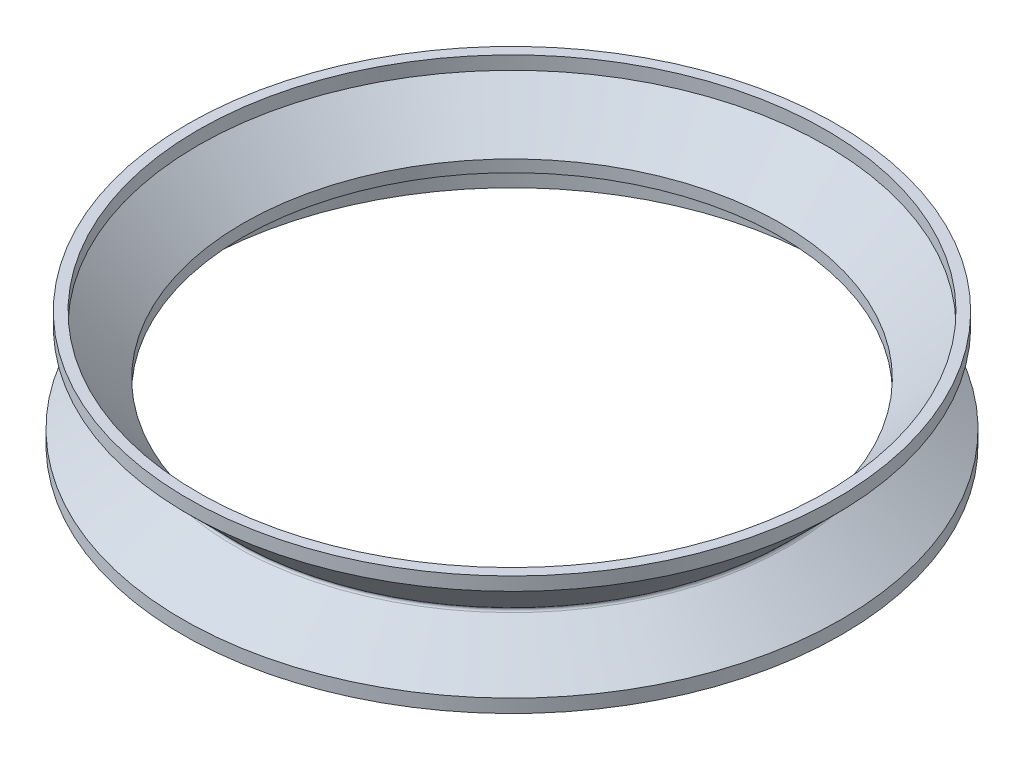
ISO-10303-21;
HEADER;
FILE_DESCRIPTION(('STEP AP214'),'2;1');
FILE_NAME('part.step','',(''),(''),'','','');
FILE_SCHEMA(('AUTOMOTIVE_DESIGN { 1 0 10303 214 1 1 1 1 }'));
ENDSEC;
DATA;
#1=APPLICATION_CONTEXT('core data for automotive mechanical design processes');
#2=APPLICATION_PROTOCOL_DEFINITION('international standard','automotive_design',2000,#1);
#3=PRODUCT_CONTEXT('',#1,'mechanical');
#4=PRODUCT('Part','Part','',(#3));
#5=PRODUCT_RELATED_PRODUCT_CATEGORY('part','',(#4));
#6=PRODUCT_DEFINITION_FORMATION('','',#4);
#7=PRODUCT_DEFINITION_CONTEXT('part definition',#1,'design');
#8=PRODUCT_DEFINITION('design','',#6,#7);
#9=PRODUCT_DEFINITION_SHAPE('','',#8);
#10=(LENGTH_UNIT() NAMED_UNIT(*) SI_UNIT(.MILLI.,.METRE.));
#11=(NAMED_UNIT(*) PLANE_ANGLE_UNIT() SI_UNIT($,.RADIAN.));
#12=(NAMED_UNIT(*) SI_UNIT($,.STERADIAN.) SOLID_ANGLE_UNIT());
#13=UNCERTAINTY_MEASURE_WITH_UNIT(LENGTH_MEASURE(1.E-05),#10,'distance_accuracy_value','');
#14=(GEOMETRIC_REPRESENTATION_CONTEXT(3) GLOBAL_UNCERTAINTY_ASSIGNED_CONTEXT((#13)) GLOBAL_UNIT_ASSIGNED_CONTEXT((#10,
#11,#12)) REPRESENTATION_CONTEXT('',''));
#15=CARTESIAN_POINT('',(0.,0.,0.));
#16=DIRECTION('',(0.,0.,1.));
#17=DIRECTION('',(1.,0.,0.));
#18=AXIS2_PLACEMENT_3D('',#15,#16,#17);
#19=CARTESIAN_POINT('',(41.7784168712443,0.,0.));
#20=DIRECTION('',(0.,-1.,0.));
#21=DIRECTION('',(1.,0.,0.));
#22=AXIS2_PLACEMENT_3D('',#19,#20,#21);
#23=CONICAL_SURFACE('',#22,41.1156349186103,0.959931088596887);
#24=CARTESIAN_POINT('',(41.7784168712443,-0.273424711459476,0.));
#25=DIRECTION('',(0.,-1.,0.));
#26=DIRECTION('',(1.,0.,0.));
#27=AXIS2_PLACEMENT_3D('',#24,#25,#26);
#28=CIRCLE('',#27,41.5061258752753);
#29=CARTESIAN_POINT('',(83.2845427465196,-0.273424711459457,0.));
#30=VERTEX_POINT('',#29);
#31=EDGE_CURVE('E10',#30,#30,#28,.T.);
#32=ORIENTED_EDGE('',*,*,#31,.T.);
#33=EDGE_LOOP('',(#32));
#34=FACE_BOUND('',#33,.T.);
#35=CARTESIAN_POINT('',(41.7784168712443,-5.79999999999999,0.));
#36=DIRECTION('',(0.,-1.,0.));
#37=DIRECTION('',(1.,0.,0.));
#38=AXIS2_PLACEMENT_3D('',#35,#36,#37);
#39=CIRCLE('',#38,49.3988933577147);
#40=CARTESIAN_POINT('',(91.177310228959,-5.79999999999999,0.));
#41=VERTEX_POINT('',#40);
#42=EDGE_CURVE('E88',#41,#41,#39,.T.);
#43=ORIENTED_EDGE('',*,*,#42,.F.);
#44=EDGE_LOOP('',(#43));
#45=FACE_BOUND('',#44,.T.);
#46=ADVANCED_FACE('F43',(#34,#45),#23,.T.);
#47=CARTESIAN_POINT('',(41.7784168712443,7.50000000000002,0.));
#48=DIRECTION('',(0.,1.,0.));
#49=DIRECTION('',(-1.,0.,0.));
#50=AXIS2_PLACEMENT_3D('',#47,#48,#49);
#51=CONICAL_SURFACE('',#50,48.6156349186104,0.785398163397454);
#52=CARTESIAN_POINT('',(41.7784168712443,0.337078818730741,0.));
#53=DIRECTION('',(0.,1.,0.));
#54=DIRECTION('',(-1.,0.,0.));
#55=AXIS2_PLACEMENT_3D('',#52,#53,#54);
#56=CIRCLE('',#55,41.4527137373411);
#57=CARTESIAN_POINT('',(0.325703133903239,0.337078818730722,0.));
#58=VERTEX_POINT('',#57);
#59=EDGE_CURVE('E51',#58,#58,#56,.T.);
#60=ORIENTED_EDGE('',*,*,#59,.T.);
#61=EDGE_LOOP('',(#60));
#62=FACE_BOUND('',#61,.T.);
#63=CARTESIAN_POINT('',(41.7784168712443,7.50000000000002,0.));
#64=DIRECTION('',(0.,1.,0.));
#65=DIRECTION('',(-1.,0.,0.));
#66=AXIS2_PLACEMENT_3D('',#63,#64,#65);
#67=CIRCLE('',#66,48.6156349186104);
#68=CARTESIAN_POINT('',(-6.83721804736612,7.5,0.));
#69=VERTEX_POINT('',#68);
#70=EDGE_CURVE('E56',#69,#69,#67,.T.);
#71=ORIENTED_EDGE('',*,*,#70,.F.);
#72=EDGE_LOOP('',(#71));
#73=FACE_BOUND('',#72,.T.);
#74=ADVANCED_FACE('F120',(#62,#73),#51,.T.);
#75=CARTESIAN_POINT('',(41.7784168712443,0.755634918610423,0.));
#76=DIRECTION('',(0.,1.,0.));
#77=DIRECTION('',(-1.,0.,0.));
#78=AXIS2_PLACEMENT_3D('',#75,#76,#77);
#79=CONICAL_SURFACE('',#78,40.3156349186103,0.785398163397454);
#80=CARTESIAN_POINT('',(41.7784168712443,7.50000000000001,0.));
#81=DIRECTION('',(0.,1.,0.));
#82=DIRECTION('',(-1.,0.,0.));
#83=AXIS2_PLACEMENT_3D('',#80,#81,#82);
#84=CIRCLE('',#83,47.06);
#85=CARTESIAN_POINT('',(-5.28158312875571,7.5,0.));
#86=VERTEX_POINT('',#85);
#87=EDGE_CURVE('E80',#86,#86,#84,.T.);
#88=ORIENTED_EDGE('',*,*,#87,.T.);
#89=EDGE_LOOP('',(#88));
#90=FACE_BOUND('',#89,.T.);
#91=CARTESIAN_POINT('',(41.7784168712443,0.755634918610423,0.));
#92=DIRECTION('',(0.,1.,0.));
#93=DIRECTION('',(-1.,0.,0.));
#94=AXIS2_PLACEMENT_3D('',#91,#92,#93);
#95=CIRCLE('',#94,40.3156349186103);
#96=CARTESIAN_POINT('',(1.46278195263397,0.755634918610404,0.));
#97=VERTEX_POINT('',#96);
#98=EDGE_CURVE('E61',#97,#97,#95,.T.);
#99=ORIENTED_EDGE('',*,*,#98,.F.);
#100=EDGE_LOOP('',(#99));
#101=FACE_BOUND('',#100,.T.);
#102=ADVANCED_FACE('F125',(#90,#101),#79,.F.);
#103=CARTESIAN_POINT('',(41.7784168712443,7.10901803281977,0.));
#104=DIRECTION('',(0.,1.,0.));
#105=DIRECTION('',(-1.,0.,0.));
#106=AXIS2_PLACEMENT_3D('',#103,#104,#105);
#107=CYLINDRICAL_SURFACE('',#106,40.3156349186103);
#108=ORIENTED_EDGE('',*,*,#98,.T.);
#109=EDGE_LOOP('',(#108));
#110=FACE_BOUND('',#109,.T.);
#111=CARTESIAN_POINT('',(41.7784168712443,-1.02684093482211,0.));
#112=DIRECTION('',(0.,1.,0.));
#113=DIRECTION('',(-1.,0.,0.));
#114=AXIS2_PLACEMENT_3D('',#111,#112,#113);
#115=CIRCLE('',#114,40.3156349186103);
#116=CARTESIAN_POINT('',(1.46278195263397,-1.02684093482212,0.));
#117=VERTEX_POINT('',#116);
#118=EDGE_CURVE('E67',#117,#117,#115,.T.);
#119=ORIENTED_EDGE('',*,*,#118,.F.);
#120=EDGE_LOOP('',(#119));
#121=FACE_BOUND('',#120,.T.);
#122=ADVANCED_FACE('F131',(#110,#121),#107,.F.);
#123=CARTESIAN_POINT('',(41.7784168712443,-5.79999999999998,0.));
#124=DIRECTION('',(0.,-1.,0.));
#125=DIRECTION('',(1.,0.,0.));
#126=AXIS2_PLACEMENT_3D('',#123,#124,#125);
#127=CONICAL_SURFACE('',#126,47.1324125234073,0.959931088596887);
#128=ORIENTED_EDGE('',*,*,#118,.T.);
#129=EDGE_LOOP('',(#128));
#130=FACE_BOUND('',#129,.T.);
#131=CARTESIAN_POINT('',(41.7784168712443,-5.79999999999998,0.));
#132=DIRECTION('',(0.,1.,0.));
#133=DIRECTION('',(-1.,0.,0.));
#134=AXIS2_PLACEMENT_3D('',#131,#132,#133);
#135=CIRCLE('',#134,47.1324125234073);
#136=CARTESIAN_POINT('',(-5.35399565216295,-5.8,0.));
#137=VERTEX_POINT('',#136);
#138=EDGE_CURVE('E71',#137,#137,#135,.T.);
#139=ORIENTED_EDGE('',*,*,#138,.F.);
#140=EDGE_LOOP('',(#139));
#141=FACE_BOUND('',#140,.T.);
#142=ADVANCED_FACE('F135',(#130,#141),#127,.F.);
#143=CARTESIAN_POINT('',(41.7784168712443,0.0542361062561216,0.));
#144=DIRECTION('',(0.,1.,0.));
#145=DIRECTION('',(-1.,0.,0.));
#146=AXIS2_PLACEMENT_3D('',#143,#144,#145);
#147=TOROIDAL_SURFACE('',#146,41.7355564498157,0.4);
#148=ORIENTED_EDGE('',*,*,#31,.F.);
#149=EDGE_LOOP('',(#148));
#150=FACE_BOUND('',#149,.T.);
#151=ORIENTED_EDGE('',*,*,#59,.F.);
#152=EDGE_LOOP('',(#151));
#153=FACE_BOUND('',#152,.T.);
#154=ADVANCED_FACE('F45',(#150,#153),#147,.F.);
#155=CARTESIAN_POINT('',(41.7784168712443,9.50000000000001,0.));
#156=DIRECTION('',(0.,1.,0.));
#157=DIRECTION('',(-1.,0.,0.));
#158=AXIS2_PLACEMENT_3D('',#155,#156,#157);
#159=PLANE('',#158);
#160=CARTESIAN_POINT('',(41.7784168712443,9.50000000000001,0.));
#161=DIRECTION('',(0.,1.,0.));
#162=DIRECTION('',(-1.,0.,0.));
#163=AXIS2_PLACEMENT_3D('',#160,#161,#162);
#164=CIRCLE('',#163,48.6156349186104);
#165=CARTESIAN_POINT('',(-6.83721804736611,9.5,0.));
#166=VERTEX_POINT('',#165);
#167=EDGE_CURVE('E75',#166,#166,#164,.T.);
#168=ORIENTED_EDGE('',*,*,#167,.T.);
#169=EDGE_LOOP('',(#168));
#170=FACE_BOUND('',#169,.T.);
#171=CARTESIAN_POINT('',(41.7784168712443,9.50000000000001,0.));
#172=DIRECTION('',(0.,1.,0.));
#173=DIRECTION('',(-1.,0.,0.));
#174=AXIS2_PLACEMENT_3D('',#171,#172,#173);
#175=CIRCLE('',#174,47.06);
#176=CARTESIAN_POINT('',(-5.28158312875571,9.5,0.));
#177=VERTEX_POINT('',#176);
#178=EDGE_CURVE('E79',#177,#177,#175,.T.);
#179=ORIENTED_EDGE('',*,*,#178,.F.);
#180=EDGE_LOOP('',(#179));
#181=FACE_BOUND('',#180,.T.);
#182=ADVANCED_FACE('F141',(#170,#181),#159,.T.);
#183=CARTESIAN_POINT('',(41.7784168712443,9.50000000000001,0.));
#184=DIRECTION('',(0.,-1.,0.));
#185=DIRECTION('',(1.,0.,0.));
#186=AXIS2_PLACEMENT_3D('',#183,#184,#185);
#187=CYLINDRICAL_SURFACE('',#186,48.6156349186104);
#188=ORIENTED_EDGE('',*,*,#167,.F.);
#189=EDGE_LOOP('',(#188));
#190=FACE_BOUND('',#189,.T.);
#191=ORIENTED_EDGE('',*,*,#70,.T.);
#192=EDGE_LOOP('',(#191));
#193=FACE_BOUND('',#192,.T.);
#194=ADVANCED_FACE('F115',(#190,#193),#187,.T.);
#195=CARTESIAN_POINT('',(41.7784168712443,9.50000000000001,0.));
#196=DIRECTION('',(0.,-1.,0.));
#197=DIRECTION('',(1.,0.,0.));
#198=AXIS2_PLACEMENT_3D('',#195,#196,#197);
#199=CYLINDRICAL_SURFACE('',#198,47.06);
#200=ORIENTED_EDGE('',*,*,#178,.T.);
#201=EDGE_LOOP('',(#200));
#202=FACE_BOUND('',#201,.T.);
#203=ORIENTED_EDGE('',*,*,#87,.F.);
#204=EDGE_LOOP('',(#203));
#205=FACE_BOUND('',#204,.T.);
#206=ADVANCED_FACE('F106',(#202,#205),#199,.F.);
#207=CARTESIAN_POINT('',(41.7784168712443,-7.79999999999999,0.));
#208=DIRECTION('',(0.,-1.,0.));
#209=DIRECTION('',(1.,0.,0.));
#210=AXIS2_PLACEMENT_3D('',#207,#208,#209);
#211=PLANE('',#210);
#212=CARTESIAN_POINT('',(41.7784168712443,-7.79999999999999,0.));
#213=DIRECTION('',(0.,-1.,0.));
#214=DIRECTION('',(1.,0.,0.));
#215=AXIS2_PLACEMENT_3D('',#212,#213,#214);
#216=CIRCLE('',#215,49.3988933577147);
#217=CARTESIAN_POINT('',(91.177310228959,-7.79999999999998,0.));
#218=VERTEX_POINT('',#217);
#219=EDGE_CURVE('E84',#218,#218,#216,.T.);
#220=ORIENTED_EDGE('',*,*,#219,.T.);
#221=EDGE_LOOP('',(#220));
#222=FACE_BOUND('',#221,.T.);
#223=CARTESIAN_POINT('',(41.7784168712443,-7.79999999999999,0.));
#224=DIRECTION('',(0.,-1.,0.));
#225=DIRECTION('',(1.,0.,0.));
#226=AXIS2_PLACEMENT_3D('',#223,#224,#225);
#227=CIRCLE('',#226,47.1324125234073);
#228=CARTESIAN_POINT('',(88.9108293946516,-7.79999999999998,0.));
#229=VERTEX_POINT('',#228);
#230=EDGE_CURVE('E92',#229,#229,#227,.T.);
#231=ORIENTED_EDGE('',*,*,#230,.F.);
#232=EDGE_LOOP('',(#231));
#233=FACE_BOUND('',#232,.T.);
#234=ADVANCED_FACE('F103',(#222,#233),#211,.T.);
#235=CARTESIAN_POINT('',(41.7784168712443,-7.79999999999999,0.));
#236=DIRECTION('',(0.,1.,0.));
#237=DIRECTION('',(-1.,0.,0.));
#238=AXIS2_PLACEMENT_3D('',#235,#236,#237);
#239=CYLINDRICAL_SURFACE('',#238,49.3988933577147);
#240=ORIENTED_EDGE('',*,*,#219,.F.);
#241=EDGE_LOOP('',(#240));
#242=FACE_BOUND('',#241,.T.);
#243=ORIENTED_EDGE('',*,*,#42,.T.);
#244=EDGE_LOOP('',(#243));
#245=FACE_BOUND('',#244,.T.);
#246=ADVANCED_FACE('F105',(#242,#245),#239,.T.);
#247=CARTESIAN_POINT('',(41.7784168712443,-7.79999999999999,0.));
#248=DIRECTION('',(0.,1.,0.));
#249=DIRECTION('',(-1.,0.,0.));
#250=AXIS2_PLACEMENT_3D('',#247,#248,#249);
#251=CYLINDRICAL_SURFACE('',#250,47.1324125234073);
#252=ORIENTED_EDGE('',*,*,#230,.T.);
#253=EDGE_LOOP('',(#252));
#254=FACE_BOUND('',#253,.T.);
#255=ORIENTED_EDGE('',*,*,#138,.T.);
#256=EDGE_LOOP('',(#255));
#257=FACE_BOUND('',#256,.T.);
#258=ADVANCED_FACE('F100',(#254,#257),#251,.F.);
#259=CLOSED_SHELL('',(#46,#74,#102,#122,#142,#154,#182,#194,#206,#234,#246,#258));
#260=MANIFOLD_SOLID_BREP('B2',#259);
#261=ADVANCED_BREP_SHAPE_REPRESENTATION('',(#18,#260),#14);
#262=SHAPE_DEFINITION_REPRESENTATION(#9,#261);
ENDSEC;
END-ISO-10303-21;
